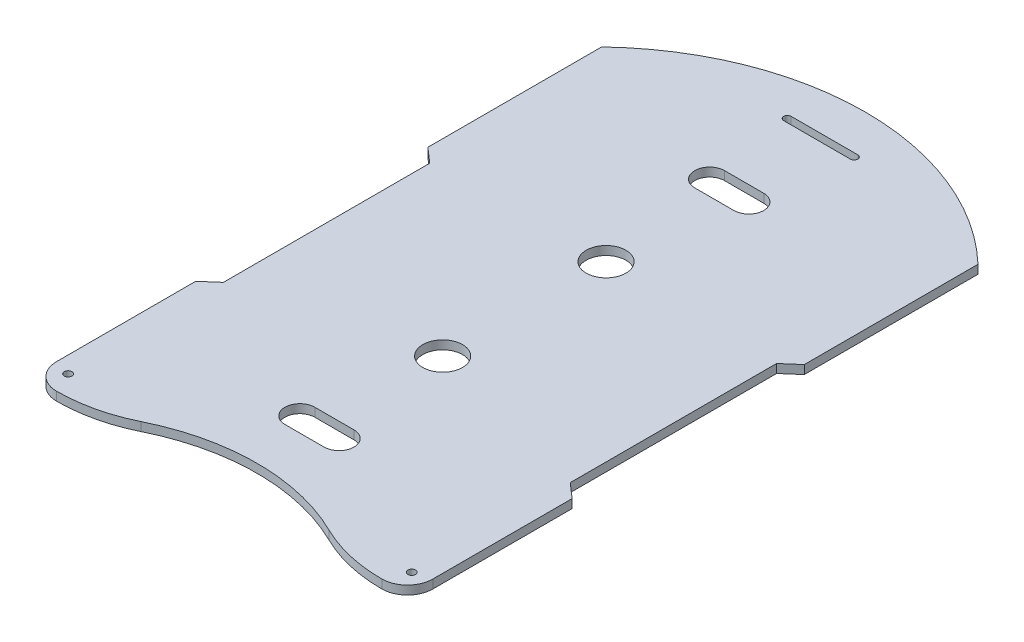
ISO-10303-21;
HEADER;
FILE_DESCRIPTION(('STEP AP214'),'2;1');
FILE_NAME('part.step','',(''),(''),'','','');
FILE_SCHEMA(('AUTOMOTIVE_DESIGN { 1 0 10303 214 1 1 1 1 }'));
ENDSEC;
DATA;
#1=APPLICATION_CONTEXT('core data for automotive mechanical design processes');
#2=APPLICATION_PROTOCOL_DEFINITION('international standard','automotive_design',2000,#1);
#3=PRODUCT_CONTEXT('',#1,'mechanical');
#4=PRODUCT('Part','Part','',(#3));
#5=PRODUCT_RELATED_PRODUCT_CATEGORY('part','',(#4));
#6=PRODUCT_DEFINITION_FORMATION('','',#4);
#7=PRODUCT_DEFINITION_CONTEXT('part definition',#1,'design');
#8=PRODUCT_DEFINITION('design','',#6,#7);
#9=PRODUCT_DEFINITION_SHAPE('','',#8);
#10=(LENGTH_UNIT() NAMED_UNIT(*) SI_UNIT(.MILLI.,.METRE.));
#11=(NAMED_UNIT(*) PLANE_ANGLE_UNIT() SI_UNIT($,.RADIAN.));
#12=(NAMED_UNIT(*) SI_UNIT($,.STERADIAN.) SOLID_ANGLE_UNIT());
#13=UNCERTAINTY_MEASURE_WITH_UNIT(LENGTH_MEASURE(1.E-05),#10,'distance_accuracy_value','');
#14=(GEOMETRIC_REPRESENTATION_CONTEXT(3) GLOBAL_UNCERTAINTY_ASSIGNED_CONTEXT((#13)) GLOBAL_UNIT_ASSIGNED_CONTEXT((#10,
#11,#12)) REPRESENTATION_CONTEXT('',''));
#15=CARTESIAN_POINT('',(0.,0.,0.));
#16=DIRECTION('',(0.,0.,1.));
#17=DIRECTION('',(1.,0.,0.));
#18=AXIS2_PLACEMENT_3D('',#15,#16,#17);
#19=CARTESIAN_POINT('',(0.,3.5,-27.6567044707429));
#20=DIRECTION('',(0.,-1.,0.));
#21=DIRECTION('',(0.,0.,-1.));
#22=AXIS2_PLACEMENT_3D('',#19,#20,#21);
#23=PLANE('',#22);
#24=CARTESIAN_POINT('',(69.2300000000004,3.5,114.59));
#25=DIRECTION('',(0.,1.,0.));
#26=DIRECTION('',(0.,0.,1.));
#27=AXIS2_PLACEMENT_3D('',#24,#25,#26);
#28=CIRCLE('',#27,1.54999999999999);
#29=CARTESIAN_POINT('',(69.2300000000004,3.5,116.14));
#30=VERTEX_POINT('',#29);
#31=EDGE_CURVE('E281',#30,#30,#28,.T.);
#32=ORIENTED_EDGE('',*,*,#31,.F.);
#33=EDGE_LOOP('',(#32));
#34=FACE_BOUND('',#33,.T.);
#35=CARTESIAN_POINT('',(-13.415,3.5,-119.43));
#36=DIRECTION('',(0.,1.,0.));
#37=DIRECTION('',(0.,0.,1.));
#38=AXIS2_PLACEMENT_3D('',#35,#36,#37);
#39=CIRCLE('',#38,1.5);
#40=CARTESIAN_POINT('',(-13.415,3.5,-120.93));
#41=VERTEX_POINT('',#40);
#42=CARTESIAN_POINT('',(-13.415,3.5,-117.93));
#43=VERTEX_POINT('',#42);
#44=EDGE_CURVE('E289',#41,#43,#39,.T.);
#45=ORIENTED_EDGE('',*,*,#44,.F.);
#46=DIRECTION('',(-1.,0.,0.));
#47=VECTOR('',#46,1.);
#48=CARTESIAN_POINT('',(-13.415,3.5,-120.93));
#49=LINE('',#48,#47);
#50=CARTESIAN_POINT('',(13.415,3.5,-120.93));
#51=VERTEX_POINT('',#50);
#52=EDGE_CURVE('E300',#51,#41,#49,.T.);
#53=ORIENTED_EDGE('',*,*,#52,.F.);
#54=CARTESIAN_POINT('',(13.415,3.5,-119.43));
#55=DIRECTION('',(0.,1.,0.));
#56=DIRECTION('',(0.,0.,1.));
#57=AXIS2_PLACEMENT_3D('',#54,#55,#56);
#58=CIRCLE('',#57,1.5);
#59=CARTESIAN_POINT('',(13.415,3.5,-117.93));
#60=VERTEX_POINT('',#59);
#61=EDGE_CURVE('E296',#60,#51,#58,.T.);
#62=ORIENTED_EDGE('',*,*,#61,.F.);
#63=DIRECTION('',(1.,0.,0.));
#64=VECTOR('',#63,1.);
#65=CARTESIAN_POINT('',(-13.415,3.5,-117.93));
#66=LINE('',#65,#64);
#67=EDGE_CURVE('E292',#43,#60,#66,.T.);
#68=ORIENTED_EDGE('',*,*,#67,.F.);
#69=EDGE_LOOP('',(#45,#53,#62,#68));
#70=FACE_BOUND('',#69,.T.);
#71=CARTESIAN_POINT('',(0.,3.5,-27.6567044707429));
#72=DIRECTION('',(0.,1.,0.));
#73=DIRECTION('',(0.,0.,-1.));
#74=AXIS2_PLACEMENT_3D('',#71,#72,#73);
#75=CIRCLE('',#74,109.723295529257);
#76=CARTESIAN_POINT('',(75.83,3.5,-106.96));
#77=VERTEX_POINT('',#76);
#78=CARTESIAN_POINT('',(-75.83,3.5,-106.96));
#79=VERTEX_POINT('',#78);
#80=EDGE_CURVE('E383',#77,#79,#75,.T.);
#81=ORIENTED_EDGE('',*,*,#80,.T.);
#82=DIRECTION('',(0.,0.,1.));
#83=VECTOR('',#82,1.);
#84=CARTESIAN_POINT('',(-75.83,3.5,-106.96));
#85=LINE('',#84,#83);
#86=CARTESIAN_POINT('',(-75.83,3.5,-36.96));
#87=VERTEX_POINT('',#86);
#88=EDGE_CURVE('E387',#79,#87,#85,.T.);
#89=ORIENTED_EDGE('',*,*,#88,.T.);
#90=DIRECTION('',(0.75296852834385,0.,0.658056528972776));
#91=VECTOR('',#90,1.);
#92=CARTESIAN_POINT('',(-69.88,3.5,-31.76));
#93=LINE('',#92,#91);
#94=CARTESIAN_POINT('',(-69.88,3.5,-31.76));
#95=VERTEX_POINT('',#94);
#96=EDGE_CURVE('E391',#87,#95,#93,.T.);
#97=ORIENTED_EDGE('',*,*,#96,.T.);
#98=DIRECTION('',(0.,0.,1.));
#99=VECTOR('',#98,1.);
#100=CARTESIAN_POINT('',(-69.88,3.5,-31.76));
#101=LINE('',#100,#99);
#102=CARTESIAN_POINT('',(-69.88,3.5,51.39));
#103=VERTEX_POINT('',#102);
#104=EDGE_CURVE('E394',#95,#103,#101,.T.);
#105=ORIENTED_EDGE('',*,*,#104,.T.);
#106=DIRECTION('',(-0.752968528343848,0.,0.658056528972778));
#107=VECTOR('',#106,1.);
#108=CARTESIAN_POINT('',(-69.88,3.5,51.39));
#109=LINE('',#108,#107);
#110=CARTESIAN_POINT('',(-75.83,3.5,56.59));
#111=VERTEX_POINT('',#110);
#112=EDGE_CURVE('E397',#103,#111,#109,.T.);
#113=ORIENTED_EDGE('',*,*,#112,.T.);
#114=DIRECTION('',(0.,0.,1.));
#115=VECTOR('',#114,1.);
#116=CARTESIAN_POINT('',(-75.83,3.5,56.59));
#117=LINE('',#116,#115);
#118=CARTESIAN_POINT('',(-75.8299999999999,3.5,112.67));
#119=VERTEX_POINT('',#118);
#120=EDGE_CURVE('E400',#111,#119,#117,.T.);
#121=ORIENTED_EDGE('',*,*,#120,.T.);
#122=CARTESIAN_POINT('',(-65.5300000000001,3.5,112.67));
#123=DIRECTION('',(0.,1.,0.));
#124=DIRECTION('',(0.,0.,-1.));
#125=AXIS2_PLACEMENT_3D('',#122,#123,#124);
#126=CIRCLE('',#125,10.2999999999999);
#127=CARTESIAN_POINT('',(-65.5299999999999,3.5,122.97));
#128=VERTEX_POINT('',#127);
#129=EDGE_CURVE('E403',#119,#128,#126,.T.);
#130=ORIENTED_EDGE('',*,*,#129,.T.);
#131=CARTESIAN_POINT('',(-65.53,3.5,60.2191764705876));
#132=DIRECTION('',(0.,1.,0.));
#133=DIRECTION('',(0.,0.,1.));
#134=AXIS2_PLACEMENT_3D('',#131,#132,#133);
#135=CIRCLE('',#134,62.7508235294124);
#136=CARTESIAN_POINT('',(-37.8413368268911,3.5,116.530842982116));
#137=VERTEX_POINT('',#136);
#138=EDGE_CURVE('E406',#128,#137,#135,.T.);
#139=ORIENTED_EDGE('',*,*,#138,.T.);
#140=CARTESIAN_POINT('',(0.,3.5,193.490453723303));
#141=DIRECTION('',(0.,-1.,0.));
#142=DIRECTION('',(0.,0.,-1.));
#143=AXIS2_PLACEMENT_3D('',#140,#141,#142);
#144=CIRCLE('',#143,85.7598300970874);
#145=CARTESIAN_POINT('',(37.8413368268912,3.5,116.530842982116));
#146=VERTEX_POINT('',#145);
#147=EDGE_CURVE('E409',#137,#146,#144,.T.);
#148=ORIENTED_EDGE('',*,*,#147,.T.);
#149=CARTESIAN_POINT('',(65.5300000000001,3.5,60.2191764705876));
#150=DIRECTION('',(0.,1.,0.));
#151=DIRECTION('',(0.,0.,-1.));
#152=AXIS2_PLACEMENT_3D('',#149,#150,#151);
#153=CIRCLE('',#152,62.7508235294124);
#154=CARTESIAN_POINT('',(65.5300000000004,3.5,122.97));
#155=VERTEX_POINT('',#154);
#156=EDGE_CURVE('E412',#146,#155,#153,.T.);
#157=ORIENTED_EDGE('',*,*,#156,.T.);
#158=CARTESIAN_POINT('',(65.5300000000004,3.5,112.67));
#159=DIRECTION('',(0.,1.,0.));
#160=DIRECTION('',(0.,0.,1.));
#161=AXIS2_PLACEMENT_3D('',#158,#159,#160);
#162=CIRCLE('',#161,10.3);
#163=CARTESIAN_POINT('',(75.8300000000004,3.5,112.67));
#164=VERTEX_POINT('',#163);
#165=EDGE_CURVE('E415',#155,#164,#162,.T.);
#166=ORIENTED_EDGE('',*,*,#165,.T.);
#167=DIRECTION('',(0.,0.,-1.));
#168=VECTOR('',#167,1.);
#169=CARTESIAN_POINT('',(75.8300000000004,3.5,56.5899999999998));
#170=LINE('',#169,#168);
#171=CARTESIAN_POINT('',(75.8300000000004,3.5,56.5899999999998));
#172=VERTEX_POINT('',#171);
#173=EDGE_CURVE('E418',#164,#172,#170,.T.);
#174=ORIENTED_EDGE('',*,*,#173,.T.);
#175=DIRECTION('',(-0.752968528343853,0.,-0.658056528972772));
#176=VECTOR('',#175,1.);
#177=CARTESIAN_POINT('',(69.8800000000001,3.5,51.3899999999996));
#178=LINE('',#177,#176);
#179=CARTESIAN_POINT('',(69.8800000000001,3.5,51.3899999999996));
#180=VERTEX_POINT('',#179);
#181=EDGE_CURVE('E421',#172,#180,#178,.T.);
#182=ORIENTED_EDGE('',*,*,#181,.T.);
#183=DIRECTION('',(0.,0.,-1.));
#184=VECTOR('',#183,1.);
#185=CARTESIAN_POINT('',(69.88,3.5,-31.7600000000004));
#186=LINE('',#185,#184);
#187=CARTESIAN_POINT('',(69.88,3.5,-31.7600000000004));
#188=VERTEX_POINT('',#187);
#189=EDGE_CURVE('E424',#180,#188,#186,.T.);
#190=ORIENTED_EDGE('',*,*,#189,.T.);
#191=DIRECTION('',(0.752968528343849,0.,-0.658056528972776));
#192=VECTOR('',#191,1.);
#193=CARTESIAN_POINT('',(75.83,3.5,-36.9600000000004));
#194=LINE('',#193,#192);
#195=CARTESIAN_POINT('',(75.83,3.5,-36.9600000000004));
#196=VERTEX_POINT('',#195);
#197=EDGE_CURVE('E427',#188,#196,#194,.T.);
#198=ORIENTED_EDGE('',*,*,#197,.T.);
#199=DIRECTION('',(0.,0.,-1.));
#200=VECTOR('',#199,1.);
#201=CARTESIAN_POINT('',(75.83,3.5,-106.96));
#202=LINE('',#201,#200);
#203=EDGE_CURVE('E430',#196,#77,#202,.T.);
#204=ORIENTED_EDGE('',*,*,#203,.T.);
#205=EDGE_LOOP('',(#81,#89,#97,#105,#113,#121,#130,#139,#148,#157,#166,#174,#182,#190,#198,#204));
#206=FACE_BOUND('',#205,.T.);
#207=CARTESIAN_POINT('',(-7.895,3.5,-82.555));
#208=DIRECTION('',(0.,1.,0.));
#209=DIRECTION('',(0.,0.,1.));
#210=AXIS2_PLACEMENT_3D('',#207,#208,#209);
#211=CIRCLE('',#210,6.01499999999999);
#212=CARTESIAN_POINT('',(-7.895,3.5,-88.57));
#213=VERTEX_POINT('',#212);
#214=CARTESIAN_POINT('',(-7.895,3.5,-76.54));
#215=VERTEX_POINT('',#214);
#216=EDGE_CURVE('E340',#213,#215,#211,.T.);
#217=ORIENTED_EDGE('',*,*,#216,.F.);
#218=DIRECTION('',(-1.,0.,0.));
#219=VECTOR('',#218,1.);
#220=CARTESIAN_POINT('',(-7.895,3.5,-88.57));
#221=LINE('',#220,#219);
#222=CARTESIAN_POINT('',(7.895,3.5,-88.57));
#223=VERTEX_POINT('',#222);
#224=EDGE_CURVE('E351',#223,#213,#221,.T.);
#225=ORIENTED_EDGE('',*,*,#224,.F.);
#226=CARTESIAN_POINT('',(7.895,3.5,-82.555));
#227=DIRECTION('',(0.,1.,0.));
#228=DIRECTION('',(0.,0.,1.));
#229=AXIS2_PLACEMENT_3D('',#226,#227,#228);
#230=CIRCLE('',#229,6.01499999999999);
#231=CARTESIAN_POINT('',(7.895,3.5,-76.54));
#232=VERTEX_POINT('',#231);
#233=EDGE_CURVE('E347',#232,#223,#230,.T.);
#234=ORIENTED_EDGE('',*,*,#233,.F.);
#235=DIRECTION('',(1.,0.,0.));
#236=VECTOR('',#235,1.);
#237=CARTESIAN_POINT('',(-7.895,3.5,-76.54));
#238=LINE('',#237,#236);
#239=EDGE_CURVE('E343',#215,#232,#238,.T.);
#240=ORIENTED_EDGE('',*,*,#239,.F.);
#241=EDGE_LOOP('',(#217,#225,#234,#240));
#242=FACE_BOUND('',#241,.T.);
#243=CARTESIAN_POINT('',(0.,3.5,-32.92));
#244=DIRECTION('',(0.,1.,0.));
#245=DIRECTION('',(0.,0.,1.));
#246=AXIS2_PLACEMENT_3D('',#243,#244,#245);
#247=CIRCLE('',#246,8.);
#248=CARTESIAN_POINT('',(0.,3.5,-24.92));
#249=VERTEX_POINT('',#248);
#250=EDGE_CURVE('E332',#249,#249,#247,.T.);
#251=ORIENTED_EDGE('',*,*,#250,.F.);
#252=EDGE_LOOP('',(#251));
#253=FACE_BOUND('',#252,.T.);
#254=CARTESIAN_POINT('',(-7.895,3.5,82.555));
#255=DIRECTION('',(0.,1.,0.));
#256=DIRECTION('',(0.,0.,-1.));
#257=AXIS2_PLACEMENT_3D('',#254,#255,#256);
#258=CIRCLE('',#257,6.01499999999999);
#259=CARTESIAN_POINT('',(-7.895,3.5,76.54));
#260=VERTEX_POINT('',#259);
#261=CARTESIAN_POINT('',(-7.895,3.5,88.57));
#262=VERTEX_POINT('',#261);
#263=EDGE_CURVE('E229',#260,#262,#258,.T.);
#264=ORIENTED_EDGE('',*,*,#263,.F.);
#265=DIRECTION('',(-1.,0.,0.));
#266=VECTOR('',#265,1.);
#267=CARTESIAN_POINT('',(-7.895,3.5,76.54));
#268=LINE('',#267,#266);
#269=CARTESIAN_POINT('',(7.895,3.5,76.54));
#270=VERTEX_POINT('',#269);
#271=EDGE_CURVE('E257',#270,#260,#268,.T.);
#272=ORIENTED_EDGE('',*,*,#271,.F.);
#273=CARTESIAN_POINT('',(7.895,3.5,82.555));
#274=DIRECTION('',(0.,1.,0.));
#275=DIRECTION('',(0.,0.,-1.));
#276=AXIS2_PLACEMENT_3D('',#273,#274,#275);
#277=CIRCLE('',#276,6.01499999999999);
#278=CARTESIAN_POINT('',(7.895,3.5,88.57));
#279=VERTEX_POINT('',#278);
#280=EDGE_CURVE('E252',#279,#270,#277,.T.);
#281=ORIENTED_EDGE('',*,*,#280,.F.);
#282=DIRECTION('',(1.,0.,0.));
#283=VECTOR('',#282,1.);
#284=CARTESIAN_POINT('',(-7.895,3.5,88.57));
#285=LINE('',#284,#283);
#286=EDGE_CURVE('E238',#262,#279,#285,.T.);
#287=ORIENTED_EDGE('',*,*,#286,.F.);
#288=EDGE_LOOP('',(#264,#272,#281,#287));
#289=FACE_BOUND('',#288,.T.);
#290=CARTESIAN_POINT('',(0.,3.5,32.92));
#291=DIRECTION('',(0.,1.,0.));
#292=DIRECTION('',(0.,0.,-1.));
#293=AXIS2_PLACEMENT_3D('',#290,#291,#292);
#294=CIRCLE('',#293,8.);
#295=CARTESIAN_POINT('',(0.,3.5,24.92));
#296=VERTEX_POINT('',#295);
#297=EDGE_CURVE('E265',#296,#296,#294,.T.);
#298=ORIENTED_EDGE('',*,*,#297,.F.);
#299=EDGE_LOOP('',(#298));
#300=FACE_BOUND('',#299,.T.);
#301=CARTESIAN_POINT('',(-69.2300000000004,3.5,114.59));
#302=DIRECTION('',(0.,1.,0.));
#303=DIRECTION('',(0.,0.,-1.));
#304=AXIS2_PLACEMENT_3D('',#301,#302,#303);
#305=CIRCLE('',#304,1.54999999999999);
#306=CARTESIAN_POINT('',(-69.2300000000004,3.5,113.04));
#307=VERTEX_POINT('',#306);
#308=EDGE_CURVE('E924',#307,#307,#305,.T.);
#309=ORIENTED_EDGE('',*,*,#308,.F.);
#310=EDGE_LOOP('',(#309));
#311=FACE_BOUND('',#310,.T.);
#312=ADVANCED_FACE('F43',(#34,#70,#206,#242,#253,#289,#300,#311),#23,.F.);
#313=CARTESIAN_POINT('',(0.,0.,-27.6567044707429));
#314=DIRECTION('',(0.,-1.,0.));
#315=DIRECTION('',(0.,0.,-1.));
#316=AXIS2_PLACEMENT_3D('',#313,#314,#315);
#317=PLANE('',#316);
#318=CARTESIAN_POINT('',(0.,0.,32.92));
#319=DIRECTION('',(0.,1.,0.));
#320=DIRECTION('',(0.,0.,-1.));
#321=AXIS2_PLACEMENT_3D('',#318,#319,#320);
#322=CIRCLE('',#321,8.);
#323=CARTESIAN_POINT('',(0.,0.,24.92));
#324=VERTEX_POINT('',#323);
#325=EDGE_CURVE('E933',#324,#324,#322,.T.);
#326=ORIENTED_EDGE('',*,*,#325,.T.);
#327=EDGE_LOOP('',(#326));
#328=FACE_BOUND('',#327,.T.);
#329=DIRECTION('',(-1.,0.,0.));
#330=VECTOR('',#329,1.);
#331=CARTESIAN_POINT('',(-13.415,0.,-120.93));
#332=LINE('',#331,#330);
#333=CARTESIAN_POINT('',(13.415,0.,-120.93));
#334=VERTEX_POINT('',#333);
#335=CARTESIAN_POINT('',(-13.415,0.,-120.93));
#336=VERTEX_POINT('',#335);
#337=EDGE_CURVE('E293',#334,#336,#332,.T.);
#338=ORIENTED_EDGE('',*,*,#337,.T.);
#339=CARTESIAN_POINT('',(-13.415,0.,-119.43));
#340=DIRECTION('',(0.,1.,0.));
#341=DIRECTION('',(0.,0.,1.));
#342=AXIS2_PLACEMENT_3D('',#339,#340,#341);
#343=CIRCLE('',#342,1.5);
#344=CARTESIAN_POINT('',(-13.415,0.,-117.93));
#345=VERTEX_POINT('',#344);
#346=EDGE_CURVE('E285',#336,#345,#343,.T.);
#347=ORIENTED_EDGE('',*,*,#346,.T.);
#348=DIRECTION('',(1.,0.,0.));
#349=VECTOR('',#348,1.);
#350=CARTESIAN_POINT('',(-13.415,0.,-117.93));
#351=LINE('',#350,#349);
#352=CARTESIAN_POINT('',(13.415,0.,-117.93));
#353=VERTEX_POINT('',#352);
#354=EDGE_CURVE('E307',#345,#353,#351,.T.);
#355=ORIENTED_EDGE('',*,*,#354,.T.);
#356=CARTESIAN_POINT('',(13.415,0.,-119.43));
#357=DIRECTION('',(0.,1.,0.));
#358=DIRECTION('',(0.,0.,1.));
#359=AXIS2_PLACEMENT_3D('',#356,#357,#358);
#360=CIRCLE('',#359,1.5);
#361=EDGE_CURVE('E311',#353,#334,#360,.T.);
#362=ORIENTED_EDGE('',*,*,#361,.T.);
#363=EDGE_LOOP('',(#338,#347,#355,#362));
#364=FACE_BOUND('',#363,.T.);
#365=CARTESIAN_POINT('',(0.,0.,-32.92));
#366=DIRECTION('',(0.,1.,0.));
#367=DIRECTION('',(0.,0.,1.));
#368=AXIS2_PLACEMENT_3D('',#365,#366,#367);
#369=CIRCLE('',#368,8.);
#370=CARTESIAN_POINT('',(0.,0.,-24.92));
#371=VERTEX_POINT('',#370);
#372=EDGE_CURVE('E331',#371,#371,#369,.T.);
#373=ORIENTED_EDGE('',*,*,#372,.T.);
#374=EDGE_LOOP('',(#373));
#375=FACE_BOUND('',#374,.T.);
#376=CARTESIAN_POINT('',(0.,0.,-27.6567044707429));
#377=DIRECTION('',(0.,1.,0.));
#378=DIRECTION('',(0.,0.,-1.));
#379=AXIS2_PLACEMENT_3D('',#376,#377,#378);
#380=CIRCLE('',#379,109.723295529257);
#381=CARTESIAN_POINT('',(75.83,0.,-106.96));
#382=VERTEX_POINT('',#381);
#383=CARTESIAN_POINT('',(-75.83,0.,-106.96));
#384=VERTEX_POINT('',#383);
#385=EDGE_CURVE('E382',#382,#384,#380,.T.);
#386=ORIENTED_EDGE('',*,*,#385,.F.);
#387=DIRECTION('',(0.,0.,-1.));
#388=VECTOR('',#387,1.);
#389=CARTESIAN_POINT('',(75.83,0.,-106.96));
#390=LINE('',#389,#388);
#391=CARTESIAN_POINT('',(75.83,0.,-36.9600000000004));
#392=VERTEX_POINT('',#391);
#393=EDGE_CURVE('E388',#392,#382,#390,.T.);
#394=ORIENTED_EDGE('',*,*,#393,.F.);
#395=DIRECTION('',(0.752968528343849,0.,-0.658056528972776));
#396=VECTOR('',#395,1.);
#397=CARTESIAN_POINT('',(75.83,0.,-36.9600000000004));
#398=LINE('',#397,#396);
#399=CARTESIAN_POINT('',(69.88,0.,-31.7600000000004));
#400=VERTEX_POINT('',#399);
#401=EDGE_CURVE('E476',#400,#392,#398,.T.);
#402=ORIENTED_EDGE('',*,*,#401,.F.);
#403=DIRECTION('',(0.,0.,-1.));
#404=VECTOR('',#403,1.);
#405=CARTESIAN_POINT('',(69.88,0.,-31.7600000000004));
#406=LINE('',#405,#404);
#407=CARTESIAN_POINT('',(69.8800000000001,0.,51.3899999999996));
#408=VERTEX_POINT('',#407);
#409=EDGE_CURVE('E473',#408,#400,#406,.T.);
#410=ORIENTED_EDGE('',*,*,#409,.F.);
#411=DIRECTION('',(-0.752968528343853,0.,-0.658056528972772));
#412=VECTOR('',#411,1.);
#413=CARTESIAN_POINT('',(69.8800000000001,0.,51.3899999999996));
#414=LINE('',#413,#412);
#415=CARTESIAN_POINT('',(75.8300000000004,0.,56.5899999999998));
#416=VERTEX_POINT('',#415);
#417=EDGE_CURVE('E470',#416,#408,#414,.T.);
#418=ORIENTED_EDGE('',*,*,#417,.F.);
#419=DIRECTION('',(0.,0.,-1.));
#420=VECTOR('',#419,1.);
#421=CARTESIAN_POINT('',(75.8300000000004,0.,56.5899999999998));
#422=LINE('',#421,#420);
#423=CARTESIAN_POINT('',(75.8300000000004,0.,112.67));
#424=VERTEX_POINT('',#423);
#425=EDGE_CURVE('E467',#424,#416,#422,.T.);
#426=ORIENTED_EDGE('',*,*,#425,.F.);
#427=CARTESIAN_POINT('',(65.5300000000004,0.,112.67));
#428=DIRECTION('',(0.,1.,0.));
#429=DIRECTION('',(0.,0.,1.));
#430=AXIS2_PLACEMENT_3D('',#427,#428,#429);
#431=CIRCLE('',#430,10.3);
#432=CARTESIAN_POINT('',(65.5300000000004,0.,122.97));
#433=VERTEX_POINT('',#432);
#434=EDGE_CURVE('E464',#433,#424,#431,.T.);
#435=ORIENTED_EDGE('',*,*,#434,.F.);
#436=CARTESIAN_POINT('',(65.5300000000001,0.,60.2191764705876));
#437=DIRECTION('',(0.,1.,0.));
#438=DIRECTION('',(0.,0.,-1.));
#439=AXIS2_PLACEMENT_3D('',#436,#437,#438);
#440=CIRCLE('',#439,62.7508235294124);
#441=CARTESIAN_POINT('',(37.8413368268912,0.,116.530842982116));
#442=VERTEX_POINT('',#441);
#443=EDGE_CURVE('E461',#442,#433,#440,.T.);
#444=ORIENTED_EDGE('',*,*,#443,.F.);
#445=CARTESIAN_POINT('',(0.,0.,193.490453723303));
#446=DIRECTION('',(0.,-1.,0.));
#447=DIRECTION('',(0.,0.,-1.));
#448=AXIS2_PLACEMENT_3D('',#445,#446,#447);
#449=CIRCLE('',#448,85.7598300970874);
#450=CARTESIAN_POINT('',(-37.8413368268911,0.,116.530842982116));
#451=VERTEX_POINT('',#450);
#452=EDGE_CURVE('E458',#451,#442,#449,.T.);
#453=ORIENTED_EDGE('',*,*,#452,.F.);
#454=CARTESIAN_POINT('',(-65.53,0.,60.2191764705876));
#455=DIRECTION('',(0.,1.,0.));
#456=DIRECTION('',(0.,0.,1.));
#457=AXIS2_PLACEMENT_3D('',#454,#455,#456);
#458=CIRCLE('',#457,62.7508235294124);
#459=CARTESIAN_POINT('',(-65.5299999999999,0.,122.97));
#460=VERTEX_POINT('',#459);
#461=EDGE_CURVE('E455',#460,#451,#458,.T.);
#462=ORIENTED_EDGE('',*,*,#461,.F.);
#463=CARTESIAN_POINT('',(-65.5300000000001,0.,112.67));
#464=DIRECTION('',(0.,1.,0.));
#465=DIRECTION('',(0.,0.,-1.));
#466=AXIS2_PLACEMENT_3D('',#463,#464,#465);
#467=CIRCLE('',#466,10.2999999999999);
#468=CARTESIAN_POINT('',(-75.8299999999999,0.,112.67));
#469=VERTEX_POINT('',#468);
#470=EDGE_CURVE('E452',#469,#460,#467,.T.);
#471=ORIENTED_EDGE('',*,*,#470,.F.);
#472=DIRECTION('',(0.,0.,1.));
#473=VECTOR('',#472,1.);
#474=CARTESIAN_POINT('',(-75.83,0.,56.59));
#475=LINE('',#474,#473);
#476=CARTESIAN_POINT('',(-75.83,0.,56.59));
#477=VERTEX_POINT('',#476);
#478=EDGE_CURVE('E449',#477,#469,#475,.T.);
#479=ORIENTED_EDGE('',*,*,#478,.F.);
#480=DIRECTION('',(-0.752968528343848,0.,0.658056528972778));
#481=VECTOR('',#480,1.);
#482=CARTESIAN_POINT('',(-69.88,0.,51.39));
#483=LINE('',#482,#481);
#484=CARTESIAN_POINT('',(-69.88,0.,51.39));
#485=VERTEX_POINT('',#484);
#486=EDGE_CURVE('E446',#485,#477,#483,.T.);
#487=ORIENTED_EDGE('',*,*,#486,.F.);
#488=DIRECTION('',(0.,0.,1.));
#489=VECTOR('',#488,1.);
#490=CARTESIAN_POINT('',(-69.88,0.,-31.76));
#491=LINE('',#490,#489);
#492=CARTESIAN_POINT('',(-69.88,0.,-31.76));
#493=VERTEX_POINT('',#492);
#494=EDGE_CURVE('E443',#493,#485,#491,.T.);
#495=ORIENTED_EDGE('',*,*,#494,.F.);
#496=DIRECTION('',(0.75296852834385,0.,0.658056528972776));
#497=VECTOR('',#496,1.);
#498=CARTESIAN_POINT('',(-69.88,0.,-31.76));
#499=LINE('',#498,#497);
#500=CARTESIAN_POINT('',(-75.83,0.,-36.96));
#501=VERTEX_POINT('',#500);
#502=EDGE_CURVE('E440',#501,#493,#499,.T.);
#503=ORIENTED_EDGE('',*,*,#502,.F.);
#504=DIRECTION('',(0.,0.,1.));
#505=VECTOR('',#504,1.);
#506=CARTESIAN_POINT('',(-75.83,0.,-106.96));
#507=LINE('',#506,#505);
#508=EDGE_CURVE('E437',#384,#501,#507,.T.);
#509=ORIENTED_EDGE('',*,*,#508,.F.);
#510=EDGE_LOOP('',(#386,#394,#402,#410,#418,#426,#435,#444,#453,#462,#471,#479,#487,#495,#503,#509));
#511=FACE_BOUND('',#510,.T.);
#512=DIRECTION('',(-1.,0.,0.));
#513=VECTOR('',#512,1.);
#514=CARTESIAN_POINT('',(-7.895,0.,-88.57));
#515=LINE('',#514,#513);
#516=CARTESIAN_POINT('',(7.895,0.,-88.57));
#517=VERTEX_POINT('',#516);
#518=CARTESIAN_POINT('',(-7.895,0.,-88.57));
#519=VERTEX_POINT('',#518);
#520=EDGE_CURVE('E344',#517,#519,#515,.T.);
#521=ORIENTED_EDGE('',*,*,#520,.T.);
#522=CARTESIAN_POINT('',(-7.895,0.,-82.555));
#523=DIRECTION('',(0.,1.,0.));
#524=DIRECTION('',(0.,0.,1.));
#525=AXIS2_PLACEMENT_3D('',#522,#523,#524);
#526=CIRCLE('',#525,6.01499999999999);
#527=CARTESIAN_POINT('',(-7.895,0.,-76.54));
#528=VERTEX_POINT('',#527);
#529=EDGE_CURVE('E336',#519,#528,#526,.T.);
#530=ORIENTED_EDGE('',*,*,#529,.T.);
#531=DIRECTION('',(1.,0.,0.));
#532=VECTOR('',#531,1.);
#533=CARTESIAN_POINT('',(-7.895,0.,-76.54));
#534=LINE('',#533,#532);
#535=CARTESIAN_POINT('',(7.895,0.,-76.54));
#536=VERTEX_POINT('',#535);
#537=EDGE_CURVE('E358',#528,#536,#534,.T.);
#538=ORIENTED_EDGE('',*,*,#537,.T.);
#539=CARTESIAN_POINT('',(7.895,0.,-82.555));
#540=DIRECTION('',(0.,1.,0.));
#541=DIRECTION('',(0.,0.,1.));
#542=AXIS2_PLACEMENT_3D('',#539,#540,#541);
#543=CIRCLE('',#542,6.01499999999999);
#544=EDGE_CURVE('E362',#536,#517,#543,.T.);
#545=ORIENTED_EDGE('',*,*,#544,.T.);
#546=EDGE_LOOP('',(#521,#530,#538,#545));
#547=FACE_BOUND('',#546,.T.);
#548=CARTESIAN_POINT('',(69.2300000000004,0.,114.59));
#549=DIRECTION('',(0.,1.,0.));
#550=DIRECTION('',(0.,0.,1.));
#551=AXIS2_PLACEMENT_3D('',#548,#549,#550);
#552=CIRCLE('',#551,1.54999999999999);
#553=CARTESIAN_POINT('',(69.2300000000004,0.,116.14));
#554=VERTEX_POINT('',#553);
#555=EDGE_CURVE('E247',#554,#554,#552,.T.);
#556=ORIENTED_EDGE('',*,*,#555,.T.);
#557=EDGE_LOOP('',(#556));
#558=FACE_BOUND('',#557,.T.);
#559=DIRECTION('',(-1.,0.,0.));
#560=VECTOR('',#559,1.);
#561=CARTESIAN_POINT('',(-7.895,0.,76.54));
#562=LINE('',#561,#560);
#563=CARTESIAN_POINT('',(7.895,0.,76.54));
#564=VERTEX_POINT('',#563);
#565=CARTESIAN_POINT('',(-7.895,0.,76.54));
#566=VERTEX_POINT('',#565);
#567=EDGE_CURVE('E239',#564,#566,#562,.T.);
#568=ORIENTED_EDGE('',*,*,#567,.T.);
#569=CARTESIAN_POINT('',(-7.895,0.,82.555));
#570=DIRECTION('',(0.,1.,0.));
#571=DIRECTION('',(0.,0.,-1.));
#572=AXIS2_PLACEMENT_3D('',#569,#570,#571);
#573=CIRCLE('',#572,6.01499999999999);
#574=CARTESIAN_POINT('',(-7.895,0.,88.57));
#575=VERTEX_POINT('',#574);
#576=EDGE_CURVE('E67',#566,#575,#573,.T.);
#577=ORIENTED_EDGE('',*,*,#576,.T.);
#578=DIRECTION('',(1.,0.,0.));
#579=VECTOR('',#578,1.);
#580=CARTESIAN_POINT('',(-7.895,0.,88.57));
#581=LINE('',#580,#579);
#582=CARTESIAN_POINT('',(7.895,0.,88.57));
#583=VERTEX_POINT('',#582);
#584=EDGE_CURVE('E245',#575,#583,#581,.T.);
#585=ORIENTED_EDGE('',*,*,#584,.T.);
#586=CARTESIAN_POINT('',(7.895,0.,82.555));
#587=DIRECTION('',(0.,1.,0.));
#588=DIRECTION('',(0.,0.,-1.));
#589=AXIS2_PLACEMENT_3D('',#586,#587,#588);
#590=CIRCLE('',#589,6.01499999999999);
#591=EDGE_CURVE('E268',#583,#564,#590,.T.);
#592=ORIENTED_EDGE('',*,*,#591,.T.);
#593=EDGE_LOOP('',(#568,#577,#585,#592));
#594=FACE_BOUND('',#593,.T.);
#595=CARTESIAN_POINT('',(-69.2300000000004,0.,114.59));
#596=DIRECTION('',(0.,1.,0.));
#597=DIRECTION('',(0.,0.,-1.));
#598=AXIS2_PLACEMENT_3D('',#595,#596,#597);
#599=CIRCLE('',#598,1.54999999999999);
#600=CARTESIAN_POINT('',(-69.2300000000004,0.,113.04));
#601=VERTEX_POINT('',#600);
#602=EDGE_CURVE('E927',#601,#601,#599,.T.);
#603=ORIENTED_EDGE('',*,*,#602,.T.);
#604=EDGE_LOOP('',(#603));
#605=FACE_BOUND('',#604,.T.);
#606=ADVANCED_FACE('F548',(#328,#364,#375,#511,#547,#558,#594,#605),#317,.T.);
#607=CARTESIAN_POINT('',(0.,3.5,-27.6567044707429));
#608=DIRECTION('',(0.,-1.,0.));
#609=DIRECTION('',(0.,0.,-1.));
#610=AXIS2_PLACEMENT_3D('',#607,#608,#609);
#611=CYLINDRICAL_SURFACE('',#610,109.723295529257);
#612=ORIENTED_EDGE('',*,*,#385,.T.);
#613=DIRECTION('',(0.,-1.,0.));
#614=VECTOR('',#613,1.);
#615=CARTESIAN_POINT('',(-75.83,3.5,-106.96));
#616=LINE('',#615,#614);
#617=EDGE_CURVE('E11',#79,#384,#616,.T.);
#618=ORIENTED_EDGE('',*,*,#617,.F.);
#619=ORIENTED_EDGE('',*,*,#80,.F.);
#620=DIRECTION('',(0.,-1.,0.));
#621=VECTOR('',#620,1.);
#622=CARTESIAN_POINT('',(75.83,3.5,-106.96));
#623=LINE('',#622,#621);
#624=EDGE_CURVE('E433',#77,#382,#623,.T.);
#625=ORIENTED_EDGE('',*,*,#624,.T.);
#626=EDGE_LOOP('',(#612,#618,#619,#625));
#627=FACE_BOUND('',#626,.T.);
#628=ADVANCED_FACE('F45',(#627),#611,.T.);
#629=CARTESIAN_POINT('',(-75.83,3.5,-106.96));
#630=DIRECTION('',(1.,0.,0.));
#631=DIRECTION('',(0.,0.,-1.));
#632=AXIS2_PLACEMENT_3D('',#629,#630,#631);
#633=PLANE('',#632);
#634=ORIENTED_EDGE('',*,*,#508,.T.);
#635=DIRECTION('',(0.,-1.,0.));
#636=VECTOR('',#635,1.);
#637=CARTESIAN_POINT('',(-75.83,3.5,-36.96));
#638=LINE('',#637,#636);
#639=EDGE_CURVE('E52',#87,#501,#638,.T.);
#640=ORIENTED_EDGE('',*,*,#639,.F.);
#641=ORIENTED_EDGE('',*,*,#88,.F.);
#642=ORIENTED_EDGE('',*,*,#617,.T.);
#643=EDGE_LOOP('',(#634,#640,#641,#642));
#644=FACE_BOUND('',#643,.T.);
#645=ADVANCED_FACE('F566',(#644),#633,.F.);
#646=CARTESIAN_POINT('',(-69.88,3.5,-31.76));
#647=DIRECTION('',(0.658056528972776,0.,-0.75296852834385));
#648=DIRECTION('',(-0.75296852834385,0.,-0.658056528972776));
#649=AXIS2_PLACEMENT_3D('',#646,#647,#648);
#650=PLANE('',#649);
#651=ORIENTED_EDGE('',*,*,#502,.T.);
#652=DIRECTION('',(0.,-1.,0.));
#653=VECTOR('',#652,1.);
#654=CARTESIAN_POINT('',(-69.88,3.5,-31.76));
#655=LINE('',#654,#653);
#656=EDGE_CURVE('E532',#95,#493,#655,.T.);
#657=ORIENTED_EDGE('',*,*,#656,.F.);
#658=ORIENTED_EDGE('',*,*,#96,.F.);
#659=ORIENTED_EDGE('',*,*,#639,.T.);
#660=EDGE_LOOP('',(#651,#657,#658,#659));
#661=FACE_BOUND('',#660,.T.);
#662=ADVANCED_FACE('F542',(#661),#650,.F.);
#663=CARTESIAN_POINT('',(-69.88,3.5,-31.76));
#664=DIRECTION('',(1.,0.,0.));
#665=DIRECTION('',(0.,0.,-1.));
#666=AXIS2_PLACEMENT_3D('',#663,#664,#665);
#667=PLANE('',#666);
#668=ORIENTED_EDGE('',*,*,#494,.T.);
#669=DIRECTION('',(0.,-1.,0.));
#670=VECTOR('',#669,1.);
#671=CARTESIAN_POINT('',(-69.88,3.5,51.39));
#672=LINE('',#671,#670);
#673=EDGE_CURVE('E528',#103,#485,#672,.T.);
#674=ORIENTED_EDGE('',*,*,#673,.F.);
#675=ORIENTED_EDGE('',*,*,#104,.F.);
#676=ORIENTED_EDGE('',*,*,#656,.T.);
#677=EDGE_LOOP('',(#668,#674,#675,#676));
#678=FACE_BOUND('',#677,.T.);
#679=ADVANCED_FACE('F554',(#678),#667,.F.);
#680=CARTESIAN_POINT('',(-69.88,3.5,51.39));
#681=DIRECTION('',(0.658056528972778,0.,0.752968528343848));
#682=DIRECTION('',(0.752968528343848,0.,-0.658056528972778));
#683=AXIS2_PLACEMENT_3D('',#680,#681,#682);
#684=PLANE('',#683);
#685=ORIENTED_EDGE('',*,*,#486,.T.);
#686=DIRECTION('',(0.,-1.,0.));
#687=VECTOR('',#686,1.);
#688=CARTESIAN_POINT('',(-75.83,3.5,56.59));
#689=LINE('',#688,#687);
#690=EDGE_CURVE('E524',#111,#477,#689,.T.);
#691=ORIENTED_EDGE('',*,*,#690,.F.);
#692=ORIENTED_EDGE('',*,*,#112,.F.);
#693=ORIENTED_EDGE('',*,*,#673,.T.);
#694=EDGE_LOOP('',(#685,#691,#692,#693));
#695=FACE_BOUND('',#694,.T.);
#696=ADVANCED_FACE('F558',(#695),#684,.F.);
#697=CARTESIAN_POINT('',(-75.83,3.5,56.59));
#698=DIRECTION('',(1.,0.,0.));
#699=DIRECTION('',(0.,0.,-1.));
#700=AXIS2_PLACEMENT_3D('',#697,#698,#699);
#701=PLANE('',#700);
#702=ORIENTED_EDGE('',*,*,#478,.T.);
#703=DIRECTION('',(0.,-1.,0.));
#704=VECTOR('',#703,1.);
#705=CARTESIAN_POINT('',(-75.8299999999999,3.5,112.67));
#706=LINE('',#705,#704);
#707=EDGE_CURVE('E520',#119,#469,#706,.T.);
#708=ORIENTED_EDGE('',*,*,#707,.F.);
#709=ORIENTED_EDGE('',*,*,#120,.F.);
#710=ORIENTED_EDGE('',*,*,#690,.T.);
#711=EDGE_LOOP('',(#702,#708,#709,#710));
#712=FACE_BOUND('',#711,.T.);
#713=ADVANCED_FACE('F619',(#712),#701,.F.);
#714=CARTESIAN_POINT('',(-65.5300000000001,3.5,112.67));
#715=DIRECTION('',(0.,-1.,0.));
#716=DIRECTION('',(0.,0.,-1.));
#717=AXIS2_PLACEMENT_3D('',#714,#715,#716);
#718=CYLINDRICAL_SURFACE('',#717,10.2999999999999);
#719=ORIENTED_EDGE('',*,*,#470,.T.);
#720=DIRECTION('',(0.,-1.,0.));
#721=VECTOR('',#720,1.);
#722=CARTESIAN_POINT('',(-65.5299999999999,3.5,122.97));
#723=LINE('',#722,#721);
#724=EDGE_CURVE('E516',#128,#460,#723,.T.);
#725=ORIENTED_EDGE('',*,*,#724,.F.);
#726=ORIENTED_EDGE('',*,*,#129,.F.);
#727=ORIENTED_EDGE('',*,*,#707,.T.);
#728=EDGE_LOOP('',(#719,#725,#726,#727));
#729=FACE_BOUND('',#728,.T.);
#730=ADVANCED_FACE('F616',(#729),#718,.T.);
#731=CARTESIAN_POINT('',(-65.53,3.5,60.2191764705876));
#732=DIRECTION('',(0.,-1.,0.));
#733=DIRECTION('',(0.,0.,-1.));
#734=AXIS2_PLACEMENT_3D('',#731,#732,#733);
#735=CYLINDRICAL_SURFACE('',#734,62.7508235294124);
#736=ORIENTED_EDGE('',*,*,#461,.T.);
#737=DIRECTION('',(0.,-1.,0.));
#738=VECTOR('',#737,1.);
#739=CARTESIAN_POINT('',(-37.8413368268911,3.5,116.530842982116));
#740=LINE('',#739,#738);
#741=EDGE_CURVE('E512',#137,#451,#740,.T.);
#742=ORIENTED_EDGE('',*,*,#741,.F.);
#743=ORIENTED_EDGE('',*,*,#138,.F.);
#744=ORIENTED_EDGE('',*,*,#724,.T.);
#745=EDGE_LOOP('',(#736,#742,#743,#744));
#746=FACE_BOUND('',#745,.T.);
#747=ADVANCED_FACE('F612',(#746),#735,.T.);
#748=CARTESIAN_POINT('',(0.,3.5,193.490453723303));
#749=DIRECTION('',(0.,-1.,0.));
#750=DIRECTION('',(0.,0.,-1.));
#751=AXIS2_PLACEMENT_3D('',#748,#749,#750);
#752=CYLINDRICAL_SURFACE('',#751,85.7598300970874);
#753=ORIENTED_EDGE('',*,*,#452,.T.);
#754=DIRECTION('',(0.,-1.,0.));
#755=VECTOR('',#754,1.);
#756=CARTESIAN_POINT('',(37.8413368268912,3.5,116.530842982116));
#757=LINE('',#756,#755);
#758=EDGE_CURVE('E508',#146,#442,#757,.T.);
#759=ORIENTED_EDGE('',*,*,#758,.F.);
#760=ORIENTED_EDGE('',*,*,#147,.F.);
#761=ORIENTED_EDGE('',*,*,#741,.T.);
#762=EDGE_LOOP('',(#753,#759,#760,#761));
#763=FACE_BOUND('',#762,.T.);
#764=ADVANCED_FACE('F608',(#763),#752,.F.);
#765=CARTESIAN_POINT('',(65.5300000000001,3.5,60.2191764705876));
#766=DIRECTION('',(0.,-1.,0.));
#767=DIRECTION('',(0.,0.,-1.));
#768=AXIS2_PLACEMENT_3D('',#765,#766,#767);
#769=CYLINDRICAL_SURFACE('',#768,62.7508235294124);
#770=ORIENTED_EDGE('',*,*,#443,.T.);
#771=DIRECTION('',(0.,-1.,0.));
#772=VECTOR('',#771,1.);
#773=CARTESIAN_POINT('',(65.5300000000004,3.5,122.97));
#774=LINE('',#773,#772);
#775=EDGE_CURVE('E504',#155,#433,#774,.T.);
#776=ORIENTED_EDGE('',*,*,#775,.F.);
#777=ORIENTED_EDGE('',*,*,#156,.F.);
#778=ORIENTED_EDGE('',*,*,#758,.T.);
#779=EDGE_LOOP('',(#770,#776,#777,#778));
#780=FACE_BOUND('',#779,.T.);
#781=ADVANCED_FACE('F603',(#780),#769,.T.);
#782=CARTESIAN_POINT('',(65.5300000000004,3.5,112.67));
#783=DIRECTION('',(0.,-1.,0.));
#784=DIRECTION('',(0.,0.,-1.));
#785=AXIS2_PLACEMENT_3D('',#782,#783,#784);
#786=CYLINDRICAL_SURFACE('',#785,10.3);
#787=ORIENTED_EDGE('',*,*,#434,.T.);
#788=DIRECTION('',(0.,-1.,0.));
#789=VECTOR('',#788,1.);
#790=CARTESIAN_POINT('',(75.8300000000004,3.5,112.67));
#791=LINE('',#790,#789);
#792=EDGE_CURVE('E500',#164,#424,#791,.T.);
#793=ORIENTED_EDGE('',*,*,#792,.F.);
#794=ORIENTED_EDGE('',*,*,#165,.F.);
#795=ORIENTED_EDGE('',*,*,#775,.T.);
#796=EDGE_LOOP('',(#787,#793,#794,#795));
#797=FACE_BOUND('',#796,.T.);
#798=ADVANCED_FACE('F597',(#797),#786,.T.);
#799=CARTESIAN_POINT('',(75.8300000000004,3.5,56.5899999999998));
#800=DIRECTION('',(-1.,0.,0.));
#801=DIRECTION('',(0.,0.,1.));
#802=AXIS2_PLACEMENT_3D('',#799,#800,#801);
#803=PLANE('',#802);
#804=ORIENTED_EDGE('',*,*,#425,.T.);
#805=DIRECTION('',(0.,-1.,0.));
#806=VECTOR('',#805,1.);
#807=CARTESIAN_POINT('',(75.8300000000004,3.5,56.5899999999998));
#808=LINE('',#807,#806);
#809=EDGE_CURVE('E496',#172,#416,#808,.T.);
#810=ORIENTED_EDGE('',*,*,#809,.F.);
#811=ORIENTED_EDGE('',*,*,#173,.F.);
#812=ORIENTED_EDGE('',*,*,#792,.T.);
#813=EDGE_LOOP('',(#804,#810,#811,#812));
#814=FACE_BOUND('',#813,.T.);
#815=ADVANCED_FACE('F593',(#814),#803,.F.);
#816=CARTESIAN_POINT('',(69.8800000000001,3.5,51.3899999999996));
#817=DIRECTION('',(-0.658056528972772,0.,0.752968528343853));
#818=DIRECTION('',(0.752968528343853,0.,0.658056528972772));
#819=AXIS2_PLACEMENT_3D('',#816,#817,#818);
#820=PLANE('',#819);
#821=ORIENTED_EDGE('',*,*,#417,.T.);
#822=DIRECTION('',(0.,-1.,0.));
#823=VECTOR('',#822,1.);
#824=CARTESIAN_POINT('',(69.8800000000001,3.5,51.3899999999996));
#825=LINE('',#824,#823);
#826=EDGE_CURVE('E492',#180,#408,#825,.T.);
#827=ORIENTED_EDGE('',*,*,#826,.F.);
#828=ORIENTED_EDGE('',*,*,#181,.F.);
#829=ORIENTED_EDGE('',*,*,#809,.T.);
#830=EDGE_LOOP('',(#821,#827,#828,#829));
#831=FACE_BOUND('',#830,.T.);
#832=ADVANCED_FACE('F588',(#831),#820,.F.);
#833=CARTESIAN_POINT('',(69.88,3.5,-31.7600000000004));
#834=DIRECTION('',(-1.,0.,0.));
#835=DIRECTION('',(0.,0.,1.));
#836=AXIS2_PLACEMENT_3D('',#833,#834,#835);
#837=PLANE('',#836);
#838=ORIENTED_EDGE('',*,*,#409,.T.);
#839=DIRECTION('',(0.,-1.,0.));
#840=VECTOR('',#839,1.);
#841=CARTESIAN_POINT('',(69.88,3.5,-31.7600000000004));
#842=LINE('',#841,#840);
#843=EDGE_CURVE('E488',#188,#400,#842,.T.);
#844=ORIENTED_EDGE('',*,*,#843,.F.);
#845=ORIENTED_EDGE('',*,*,#189,.F.);
#846=ORIENTED_EDGE('',*,*,#826,.T.);
#847=EDGE_LOOP('',(#838,#844,#845,#846));
#848=FACE_BOUND('',#847,.T.);
#849=ADVANCED_FACE('F582',(#848),#837,.F.);
#850=CARTESIAN_POINT('',(75.83,3.5,-36.9600000000004));
#851=DIRECTION('',(-0.658056528972776,0.,-0.752968528343849));
#852=DIRECTION('',(-0.752968528343849,0.,0.658056528972776));
#853=AXIS2_PLACEMENT_3D('',#850,#851,#852);
#854=PLANE('',#853);
#855=ORIENTED_EDGE('',*,*,#401,.T.);
#856=DIRECTION('',(0.,-1.,0.));
#857=VECTOR('',#856,1.);
#858=CARTESIAN_POINT('',(75.83,3.5,-36.9600000000004));
#859=LINE('',#858,#857);
#860=EDGE_CURVE('E484',#196,#392,#859,.T.);
#861=ORIENTED_EDGE('',*,*,#860,.F.);
#862=ORIENTED_EDGE('',*,*,#197,.F.);
#863=ORIENTED_EDGE('',*,*,#843,.T.);
#864=EDGE_LOOP('',(#855,#861,#862,#863));
#865=FACE_BOUND('',#864,.T.);
#866=ADVANCED_FACE('F578',(#865),#854,.F.);
#867=CARTESIAN_POINT('',(75.83,3.5,-106.96));
#868=DIRECTION('',(-1.,0.,0.));
#869=DIRECTION('',(0.,0.,1.));
#870=AXIS2_PLACEMENT_3D('',#867,#868,#869);
#871=PLANE('',#870);
#872=ORIENTED_EDGE('',*,*,#393,.T.);
#873=ORIENTED_EDGE('',*,*,#624,.F.);
#874=ORIENTED_EDGE('',*,*,#203,.F.);
#875=ORIENTED_EDGE('',*,*,#860,.T.);
#876=EDGE_LOOP('',(#872,#873,#874,#875));
#877=FACE_BOUND('',#876,.T.);
#878=ADVANCED_FACE('F573',(#877),#871,.F.);
#879=CARTESIAN_POINT('',(-7.895,3.5,-82.555));
#880=DIRECTION('',(0.,-1.,0.));
#881=DIRECTION('',(0.,0.,-1.));
#882=AXIS2_PLACEMENT_3D('',#879,#880,#881);
#883=CYLINDRICAL_SURFACE('',#882,6.01499999999999);
#884=ORIENTED_EDGE('',*,*,#529,.F.);
#885=DIRECTION('',(0.,-1.,0.));
#886=VECTOR('',#885,1.);
#887=CARTESIAN_POINT('',(-7.895,3.5,-88.57));
#888=LINE('',#887,#886);
#889=EDGE_CURVE('E354',#213,#519,#888,.T.);
#890=ORIENTED_EDGE('',*,*,#889,.F.);
#891=ORIENTED_EDGE('',*,*,#216,.T.);
#892=DIRECTION('',(0.,-1.,0.));
#893=VECTOR('',#892,1.);
#894=CARTESIAN_POINT('',(-7.895,3.5,-76.54));
#895=LINE('',#894,#893);
#896=EDGE_CURVE('E378',#215,#528,#895,.T.);
#897=ORIENTED_EDGE('',*,*,#896,.T.);
#898=EDGE_LOOP('',(#884,#890,#891,#897));
#899=FACE_BOUND('',#898,.T.);
#900=ADVANCED_FACE('F639',(#899),#883,.F.);
#901=CARTESIAN_POINT('',(-7.895,3.5,-76.54));
#902=DIRECTION('',(0.,0.,-1.));
#903=DIRECTION('',(-1.,0.,0.));
#904=AXIS2_PLACEMENT_3D('',#901,#902,#903);
#905=PLANE('',#904);
#906=ORIENTED_EDGE('',*,*,#537,.F.);
#907=ORIENTED_EDGE('',*,*,#896,.F.);
#908=ORIENTED_EDGE('',*,*,#239,.T.);
#909=DIRECTION('',(0.,-1.,0.));
#910=VECTOR('',#909,1.);
#911=CARTESIAN_POINT('',(7.895,3.5,-76.54));
#912=LINE('',#911,#910);
#913=EDGE_CURVE('E375',#232,#536,#912,.T.);
#914=ORIENTED_EDGE('',*,*,#913,.T.);
#915=EDGE_LOOP('',(#906,#907,#908,#914));
#916=FACE_BOUND('',#915,.T.);
#917=ADVANCED_FACE('F701',(#916),#905,.T.);
#918=CARTESIAN_POINT('',(7.895,3.5,-82.555));
#919=DIRECTION('',(0.,-1.,0.));
#920=DIRECTION('',(0.,0.,-1.));
#921=AXIS2_PLACEMENT_3D('',#918,#919,#920);
#922=CYLINDRICAL_SURFACE('',#921,6.01499999999999);
#923=ORIENTED_EDGE('',*,*,#544,.F.);
#924=ORIENTED_EDGE('',*,*,#913,.F.);
#925=ORIENTED_EDGE('',*,*,#233,.T.);
#926=DIRECTION('',(0.,-1.,0.));
#927=VECTOR('',#926,1.);
#928=CARTESIAN_POINT('',(7.895,3.5,-88.57));
#929=LINE('',#928,#927);
#930=EDGE_CURVE('E372',#223,#517,#929,.T.);
#931=ORIENTED_EDGE('',*,*,#930,.T.);
#932=EDGE_LOOP('',(#923,#924,#925,#931));
#933=FACE_BOUND('',#932,.T.);
#934=ADVANCED_FACE('F708',(#933),#922,.F.);
#935=CARTESIAN_POINT('',(-7.895,3.5,-88.57));
#936=DIRECTION('',(0.,0.,1.));
#937=DIRECTION('',(1.,0.,0.));
#938=AXIS2_PLACEMENT_3D('',#935,#936,#937);
#939=PLANE('',#938);
#940=ORIENTED_EDGE('',*,*,#520,.F.);
#941=ORIENTED_EDGE('',*,*,#930,.F.);
#942=ORIENTED_EDGE('',*,*,#224,.T.);
#943=ORIENTED_EDGE('',*,*,#889,.T.);
#944=EDGE_LOOP('',(#940,#941,#942,#943));
#945=FACE_BOUND('',#944,.T.);
#946=ADVANCED_FACE('F715',(#945),#939,.T.);
#947=CARTESIAN_POINT('',(0.,3.5,-32.92));
#948=DIRECTION('',(0.,-1.,0.));
#949=DIRECTION('',(0.,0.,-1.));
#950=AXIS2_PLACEMENT_3D('',#947,#948,#949);
#951=CYLINDRICAL_SURFACE('',#950,8.);
#952=ORIENTED_EDGE('',*,*,#250,.T.);
#953=EDGE_LOOP('',(#952));
#954=FACE_BOUND('',#953,.T.);
#955=ORIENTED_EDGE('',*,*,#372,.F.);
#956=EDGE_LOOP('',(#955));
#957=FACE_BOUND('',#956,.T.);
#958=ADVANCED_FACE('F723',(#954,#957),#951,.F.);
#959=CARTESIAN_POINT('',(-13.415,3.5,-119.43));
#960=DIRECTION('',(0.,-1.,0.));
#961=DIRECTION('',(0.,0.,-1.));
#962=AXIS2_PLACEMENT_3D('',#959,#960,#961);
#963=CYLINDRICAL_SURFACE('',#962,1.5);
#964=ORIENTED_EDGE('',*,*,#346,.F.);
#965=DIRECTION('',(0.,-1.,0.));
#966=VECTOR('',#965,1.);
#967=CARTESIAN_POINT('',(-13.415,3.5,-120.93));
#968=LINE('',#967,#966);
#969=EDGE_CURVE('E303',#41,#336,#968,.T.);
#970=ORIENTED_EDGE('',*,*,#969,.F.);
#971=ORIENTED_EDGE('',*,*,#44,.T.);
#972=DIRECTION('',(0.,-1.,0.));
#973=VECTOR('',#972,1.);
#974=CARTESIAN_POINT('',(-13.415,3.5,-117.93));
#975=LINE('',#974,#973);
#976=EDGE_CURVE('E327',#43,#345,#975,.T.);
#977=ORIENTED_EDGE('',*,*,#976,.T.);
#978=EDGE_LOOP('',(#964,#970,#971,#977));
#979=FACE_BOUND('',#978,.T.);
#980=ADVANCED_FACE('F731',(#979),#963,.F.);
#981=CARTESIAN_POINT('',(-13.415,3.5,-117.93));
#982=DIRECTION('',(0.,0.,-1.));
#983=DIRECTION('',(-1.,0.,0.));
#984=AXIS2_PLACEMENT_3D('',#981,#982,#983);
#985=PLANE('',#984);
#986=ORIENTED_EDGE('',*,*,#354,.F.);
#987=ORIENTED_EDGE('',*,*,#976,.F.);
#988=ORIENTED_EDGE('',*,*,#67,.T.);
#989=DIRECTION('',(0.,-1.,0.));
#990=VECTOR('',#989,1.);
#991=CARTESIAN_POINT('',(13.415,3.5,-117.93));
#992=LINE('',#991,#990);
#993=EDGE_CURVE('E324',#60,#353,#992,.T.);
#994=ORIENTED_EDGE('',*,*,#993,.T.);
#995=EDGE_LOOP('',(#986,#987,#988,#994));
#996=FACE_BOUND('',#995,.T.);
#997=ADVANCED_FACE('F739',(#996),#985,.T.);
#998=CARTESIAN_POINT('',(13.415,3.5,-119.43));
#999=DIRECTION('',(0.,-1.,0.));
#1000=DIRECTION('',(0.,0.,-1.));
#1001=AXIS2_PLACEMENT_3D('',#998,#999,#1000);
#1002=CYLINDRICAL_SURFACE('',#1001,1.5);
#1003=ORIENTED_EDGE('',*,*,#361,.F.);
#1004=ORIENTED_EDGE('',*,*,#993,.F.);
#1005=ORIENTED_EDGE('',*,*,#61,.T.);
#1006=DIRECTION('',(0.,-1.,0.));
#1007=VECTOR('',#1006,1.);
#1008=CARTESIAN_POINT('',(13.415,3.5,-120.93));
#1009=LINE('',#1008,#1007);
#1010=EDGE_CURVE('E321',#51,#334,#1009,.T.);
#1011=ORIENTED_EDGE('',*,*,#1010,.T.);
#1012=EDGE_LOOP('',(#1003,#1004,#1005,#1011));
#1013=FACE_BOUND('',#1012,.T.);
#1014=ADVANCED_FACE('F747',(#1013),#1002,.F.);
#1015=CARTESIAN_POINT('',(-13.415,3.5,-120.93));
#1016=DIRECTION('',(0.,0.,1.));
#1017=DIRECTION('',(1.,0.,0.));
#1018=AXIS2_PLACEMENT_3D('',#1015,#1016,#1017);
#1019=PLANE('',#1018);
#1020=ORIENTED_EDGE('',*,*,#337,.F.);
#1021=ORIENTED_EDGE('',*,*,#1010,.F.);
#1022=ORIENTED_EDGE('',*,*,#52,.T.);
#1023=ORIENTED_EDGE('',*,*,#969,.T.);
#1024=EDGE_LOOP('',(#1020,#1021,#1022,#1023));
#1025=FACE_BOUND('',#1024,.T.);
#1026=ADVANCED_FACE('F755',(#1025),#1019,.T.);
#1027=CARTESIAN_POINT('',(69.2300000000004,3.5,114.59));
#1028=DIRECTION('',(0.,-1.,0.));
#1029=DIRECTION('',(0.,0.,-1.));
#1030=AXIS2_PLACEMENT_3D('',#1027,#1028,#1029);
#1031=CYLINDRICAL_SURFACE('',#1030,1.54999999999999);
#1032=ORIENTED_EDGE('',*,*,#31,.T.);
#1033=EDGE_LOOP('',(#1032));
#1034=FACE_BOUND('',#1033,.T.);
#1035=ORIENTED_EDGE('',*,*,#555,.F.);
#1036=EDGE_LOOP('',(#1035));
#1037=FACE_BOUND('',#1036,.T.);
#1038=ADVANCED_FACE('F763',(#1034,#1037),#1031,.F.);
#1039=CARTESIAN_POINT('',(-7.895,3.5,82.555));
#1040=DIRECTION('',(0.,-1.,0.));
#1041=DIRECTION('',(0.,0.,-1.));
#1042=AXIS2_PLACEMENT_3D('',#1039,#1040,#1041);
#1043=CYLINDRICAL_SURFACE('',#1042,6.01499999999999);
#1044=ORIENTED_EDGE('',*,*,#576,.F.);
#1045=DIRECTION('',(0.,-1.,0.));
#1046=VECTOR('',#1045,1.);
#1047=CARTESIAN_POINT('',(-7.895,3.5,76.54));
#1048=LINE('',#1047,#1046);
#1049=EDGE_CURVE('E233',#260,#566,#1048,.T.);
#1050=ORIENTED_EDGE('',*,*,#1049,.F.);
#1051=ORIENTED_EDGE('',*,*,#263,.T.);
#1052=DIRECTION('',(0.,-1.,0.));
#1053=VECTOR('',#1052,1.);
#1054=CARTESIAN_POINT('',(-7.895,3.5,88.57));
#1055=LINE('',#1054,#1053);
#1056=EDGE_CURVE('E232',#262,#575,#1055,.T.);
#1057=ORIENTED_EDGE('',*,*,#1056,.T.);
#1058=EDGE_LOOP('',(#1044,#1050,#1051,#1057));
#1059=FACE_BOUND('',#1058,.T.);
#1060=ADVANCED_FACE('F231',(#1059),#1043,.F.);
#1061=CARTESIAN_POINT('',(-7.895,3.5,88.57));
#1062=DIRECTION('',(0.,0.,-1.));
#1063=DIRECTION('',(-1.,0.,0.));
#1064=AXIS2_PLACEMENT_3D('',#1061,#1062,#1063);
#1065=PLANE('',#1064);
#1066=ORIENTED_EDGE('',*,*,#584,.F.);
#1067=ORIENTED_EDGE('',*,*,#1056,.F.);
#1068=ORIENTED_EDGE('',*,*,#286,.T.);
#1069=DIRECTION('',(0.,-1.,0.));
#1070=VECTOR('',#1069,1.);
#1071=CARTESIAN_POINT('',(7.895,3.5,88.57));
#1072=LINE('',#1071,#1070);
#1073=EDGE_CURVE('E248',#279,#583,#1072,.T.);
#1074=ORIENTED_EDGE('',*,*,#1073,.T.);
#1075=EDGE_LOOP('',(#1066,#1067,#1068,#1074));
#1076=FACE_BOUND('',#1075,.T.);
#1077=ADVANCED_FACE('F242',(#1076),#1065,.T.);
#1078=CARTESIAN_POINT('',(7.895,3.5,82.555));
#1079=DIRECTION('',(0.,-1.,0.));
#1080=DIRECTION('',(0.,0.,-1.));
#1081=AXIS2_PLACEMENT_3D('',#1078,#1079,#1080);
#1082=CYLINDRICAL_SURFACE('',#1081,6.01499999999999);
#1083=ORIENTED_EDGE('',*,*,#591,.F.);
#1084=ORIENTED_EDGE('',*,*,#1073,.F.);
#1085=ORIENTED_EDGE('',*,*,#280,.T.);
#1086=DIRECTION('',(0.,-1.,0.));
#1087=VECTOR('',#1086,1.);
#1088=CARTESIAN_POINT('',(7.895,3.5,76.54));
#1089=LINE('',#1088,#1087);
#1090=EDGE_CURVE('E59',#270,#564,#1089,.T.);
#1091=ORIENTED_EDGE('',*,*,#1090,.T.);
#1092=EDGE_LOOP('',(#1083,#1084,#1085,#1091));
#1093=FACE_BOUND('',#1092,.T.);
#1094=ADVANCED_FACE('F784',(#1093),#1082,.F.);
#1095=CARTESIAN_POINT('',(-7.895,3.5,76.54));
#1096=DIRECTION('',(0.,0.,1.));
#1097=DIRECTION('',(1.,0.,0.));
#1098=AXIS2_PLACEMENT_3D('',#1095,#1096,#1097);
#1099=PLANE('',#1098);
#1100=ORIENTED_EDGE('',*,*,#567,.F.);
#1101=ORIENTED_EDGE('',*,*,#1090,.F.);
#1102=ORIENTED_EDGE('',*,*,#271,.T.);
#1103=ORIENTED_EDGE('',*,*,#1049,.T.);
#1104=EDGE_LOOP('',(#1100,#1101,#1102,#1103));
#1105=FACE_BOUND('',#1104,.T.);
#1106=ADVANCED_FACE('F791',(#1105),#1099,.T.);
#1107=CARTESIAN_POINT('',(0.,3.5,32.92));
#1108=DIRECTION('',(0.,-1.,0.));
#1109=DIRECTION('',(0.,0.,-1.));
#1110=AXIS2_PLACEMENT_3D('',#1107,#1108,#1109);
#1111=CYLINDRICAL_SURFACE('',#1110,8.);
#1112=ORIENTED_EDGE('',*,*,#297,.T.);
#1113=EDGE_LOOP('',(#1112));
#1114=FACE_BOUND('',#1113,.T.);
#1115=ORIENTED_EDGE('',*,*,#325,.F.);
#1116=EDGE_LOOP('',(#1115));
#1117=FACE_BOUND('',#1116,.T.);
#1118=ADVANCED_FACE('F799',(#1114,#1117),#1111,.F.);
#1119=CARTESIAN_POINT('',(-69.2300000000004,3.5,114.59));
#1120=DIRECTION('',(0.,-1.,0.));
#1121=DIRECTION('',(0.,0.,-1.));
#1122=AXIS2_PLACEMENT_3D('',#1119,#1120,#1121);
#1123=CYLINDRICAL_SURFACE('',#1122,1.54999999999999);
#1124=ORIENTED_EDGE('',*,*,#308,.T.);
#1125=EDGE_LOOP('',(#1124));
#1126=FACE_BOUND('',#1125,.T.);
#1127=ORIENTED_EDGE('',*,*,#602,.F.);
#1128=EDGE_LOOP('',(#1127));
#1129=FACE_BOUND('',#1128,.T.);
#1130=ADVANCED_FACE('F806',(#1126,#1129),#1123,.F.);
#1131=CLOSED_SHELL('',(#312,#606,#628,#645,#662,#679,#696,#713,#730,#747,#764,#781,#798,#815,
#832,#849,#866,#878,#900,#917,#934,#946,#958,#980,#997,#1014,#1026,#1038,#1060,#1077,#1094,
#1106,#1118,#1130));
#1132=MANIFOLD_SOLID_BREP('B2',#1131);
#1133=ADVANCED_BREP_SHAPE_REPRESENTATION('',(#18,#1132),#14);
#1134=SHAPE_DEFINITION_REPRESENTATION(#9,#1133);
ENDSEC;
END-ISO-10303-21;
